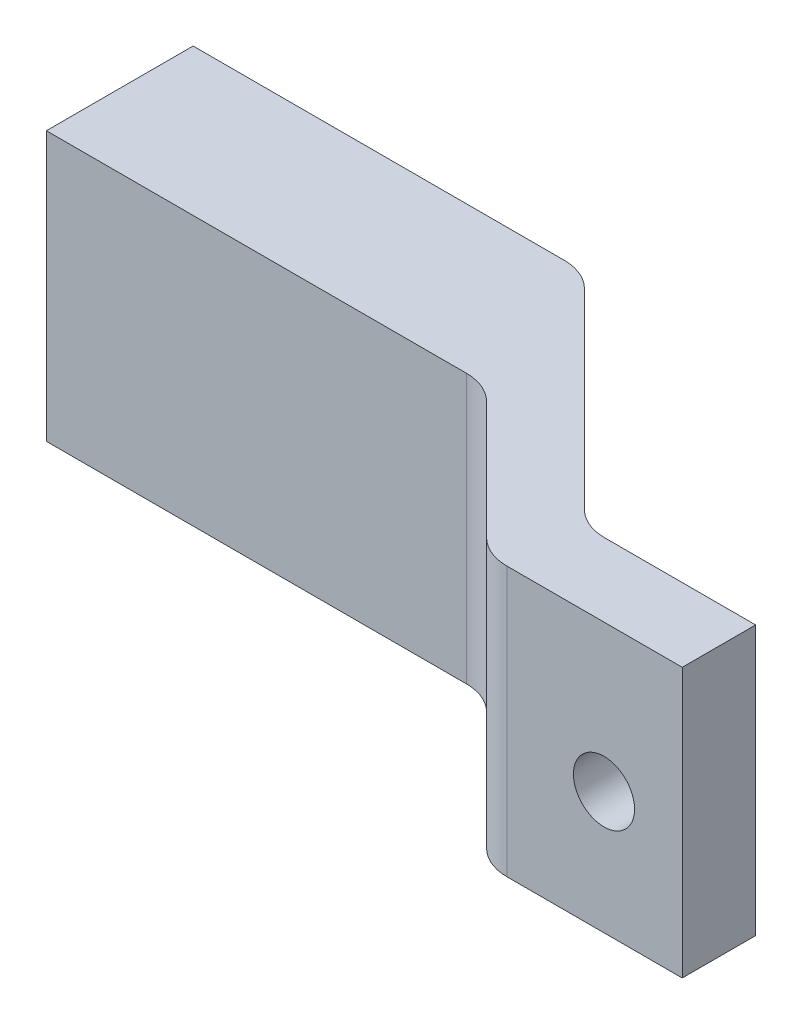
ISO-10303-21;
HEADER;
FILE_DESCRIPTION(('STEP AP214'),'2;1');
FILE_NAME('part.step','',(''),(''),'','','');
FILE_SCHEMA(('AUTOMOTIVE_DESIGN { 1 0 10303 214 1 1 1 1 }'));
ENDSEC;
DATA;
#1=APPLICATION_CONTEXT('core data for automotive mechanical design processes');
#2=APPLICATION_PROTOCOL_DEFINITION('international standard','automotive_design',2000,#1);
#3=PRODUCT_CONTEXT('',#1,'mechanical');
#4=PRODUCT('Part','Part','',(#3));
#5=PRODUCT_RELATED_PRODUCT_CATEGORY('part','',(#4));
#6=PRODUCT_DEFINITION_FORMATION('','',#4);
#7=PRODUCT_DEFINITION_CONTEXT('part definition',#1,'design');
#8=PRODUCT_DEFINITION('design','',#6,#7);
#9=PRODUCT_DEFINITION_SHAPE('','',#8);
#10=(LENGTH_UNIT() NAMED_UNIT(*) SI_UNIT(.MILLI.,.METRE.));
#11=(NAMED_UNIT(*) PLANE_ANGLE_UNIT() SI_UNIT($,.RADIAN.));
#12=(NAMED_UNIT(*) SI_UNIT($,.STERADIAN.) SOLID_ANGLE_UNIT());
#13=UNCERTAINTY_MEASURE_WITH_UNIT(LENGTH_MEASURE(1.E-05),#10,'distance_accuracy_value','');
#14=(GEOMETRIC_REPRESENTATION_CONTEXT(3) GLOBAL_UNCERTAINTY_ASSIGNED_CONTEXT((#13)) GLOBAL_UNIT_ASSIGNED_CONTEXT((#10,
#11,#12)) REPRESENTATION_CONTEXT('',''));
#15=CARTESIAN_POINT('',(0.,0.,0.));
#16=DIRECTION('',(0.,0.,1.));
#17=DIRECTION('',(1.,0.,0.));
#18=AXIS2_PLACEMENT_3D('',#15,#16,#17);
#19=CARTESIAN_POINT('',(0.,0.,6.));
#20=DIRECTION('',(1.,0.,0.));
#21=DIRECTION('',(0.,1.,0.));
#22=AXIS2_PLACEMENT_3D('',#19,#20,#21);
#23=PLANE('',#22);
#24=CARTESIAN_POINT('',(0.,-5.7,2.2));
#25=DIRECTION('',(-1.,0.,0.));
#26=DIRECTION('',(0.,-1.,0.));
#27=AXIS2_PLACEMENT_3D('',#24,#25,#26);
#28=CIRCLE('',#27,1.25);
#29=CARTESIAN_POINT('',(0.,-6.95,2.2));
#30=VERTEX_POINT('',#29);
#31=EDGE_CURVE('E179',#30,#30,#28,.T.);
#32=ORIENTED_EDGE('',*,*,#31,.F.);
#33=EDGE_LOOP('',(#32));
#34=FACE_BOUND('',#33,.T.);
#35=DIRECTION('',(0.,-1.,0.));
#36=VECTOR('',#35,1.);
#37=CARTESIAN_POINT('',(0.,0.,0.));
#38=LINE('',#37,#36);
#39=CARTESIAN_POINT('',(0.,0.,0.));
#40=VERTEX_POINT('',#39);
#41=CARTESIAN_POINT('',(0.,-11.,0.));
#42=VERTEX_POINT('',#41);
#43=EDGE_CURVE('E197',#40,#42,#38,.T.);
#44=ORIENTED_EDGE('',*,*,#43,.T.);
#45=DIRECTION('',(0.,0.,-1.));
#46=VECTOR('',#45,1.);
#47=CARTESIAN_POINT('',(0.,-11.,6.));
#48=LINE('',#47,#46);
#49=CARTESIAN_POINT('',(0.,-11.,6.));
#50=VERTEX_POINT('',#49);
#51=EDGE_CURVE('E227',#50,#42,#48,.T.);
#52=ORIENTED_EDGE('',*,*,#51,.F.);
#53=DIRECTION('',(0.,-1.,0.));
#54=VECTOR('',#53,1.);
#55=CARTESIAN_POINT('',(0.,0.,6.));
#56=LINE('',#55,#54);
#57=CARTESIAN_POINT('',(0.,0.,6.));
#58=VERTEX_POINT('',#57);
#59=EDGE_CURVE('E198',#58,#50,#56,.T.);
#60=ORIENTED_EDGE('',*,*,#59,.F.);
#61=DIRECTION('',(0.,0.,-1.));
#62=VECTOR('',#61,1.);
#63=CARTESIAN_POINT('',(0.,0.,6.));
#64=LINE('',#63,#62);
#65=EDGE_CURVE('E210',#58,#40,#64,.T.);
#66=ORIENTED_EDGE('',*,*,#65,.T.);
#67=EDGE_LOOP('',(#44,#52,#60,#66));
#68=FACE_BOUND('',#67,.T.);
#69=ADVANCED_FACE('F47',(#34,#68),#23,.F.);
#70=CARTESIAN_POINT('',(0.,-11.,6.));
#71=DIRECTION('',(0.,1.,0.));
#72=DIRECTION('',(0.,0.,1.));
#73=AXIS2_PLACEMENT_3D('',#70,#71,#72);
#74=PLANE('',#73);
#75=DIRECTION('',(1.,0.,0.));
#76=VECTOR('',#75,1.);
#77=CARTESIAN_POINT('',(0.,-11.,0.));
#78=LINE('',#77,#76);
#79=CARTESIAN_POINT('',(15.1715728752537,-11.,0.));
#80=VERTEX_POINT('',#79);
#81=EDGE_CURVE('E214',#42,#80,#78,.T.);
#82=ORIENTED_EDGE('',*,*,#81,.T.);
#83=CARTESIAN_POINT('',(15.1715728752537,-11.,2.));
#84=DIRECTION('',(0.,1.,0.));
#85=DIRECTION('',(0.,0.,1.));
#86=AXIS2_PLACEMENT_3D('',#83,#84,#85);
#87=CIRCLE('',#86,2.);
#88=CARTESIAN_POINT('',(16.5857864376268,-11.,0.58578643762691));
#89=VERTEX_POINT('',#88);
#90=EDGE_CURVE('E266',#80,#89,#87,.F.);
#91=ORIENTED_EDGE('',*,*,#90,.T.);
#92=DIRECTION('',(-0.707106781186544,0.,-0.707106781186551));
#93=VECTOR('',#92,1.);
#94=CARTESIAN_POINT('',(26.,-11.,10.0000000000002));
#95=LINE('',#94,#93);
#96=CARTESIAN_POINT('',(18.,-11.,2.00000000000009));
#97=VERTEX_POINT('',#96);
#98=EDGE_CURVE('E244',#89,#97,#95,.F.);
#99=ORIENTED_EDGE('',*,*,#98,.T.);
#100=DIRECTION('',(0.,0.,-1.));
#101=VECTOR('',#100,1.);
#102=CARTESIAN_POINT('',(18.,-11.,6.));
#103=LINE('',#102,#101);
#104=CARTESIAN_POINT('',(18.,-11.,6.));
#105=VERTEX_POINT('',#104);
#106=EDGE_CURVE('E223',#105,#97,#103,.T.);
#107=ORIENTED_EDGE('',*,*,#106,.F.);
#108=DIRECTION('',(-0.707106781186546,0.,-0.707106781186549));
#109=VECTOR('',#108,1.);
#110=CARTESIAN_POINT('',(24.,-11.,12.));
#111=LINE('',#110,#109);
#112=CARTESIAN_POINT('',(18.5857864376269,-11.,6.58578643762691));
#113=VERTEX_POINT('',#112);
#114=EDGE_CURVE('E62',#113,#105,#111,.T.);
#115=ORIENTED_EDGE('',*,*,#114,.F.);
#116=CARTESIAN_POINT('',(17.1715728752538,-11.,8.));
#117=DIRECTION('',(0.,1.,0.));
#118=DIRECTION('',(0.,0.,1.));
#119=AXIS2_PLACEMENT_3D('',#116,#117,#118);
#120=CIRCLE('',#119,2.);
#121=CARTESIAN_POINT('',(17.1715728752538,-11.,6.));
#122=VERTEX_POINT('',#121);
#123=EDGE_CURVE('E11',#113,#122,#120,.T.);
#124=ORIENTED_EDGE('',*,*,#123,.T.);
#125=DIRECTION('',(1.,0.,0.));
#126=VECTOR('',#125,1.);
#127=CARTESIAN_POINT('',(0.,-11.,6.));
#128=LINE('',#127,#126);
#129=EDGE_CURVE('E202',#50,#122,#128,.T.);
#130=ORIENTED_EDGE('',*,*,#129,.F.);
#131=ORIENTED_EDGE('',*,*,#51,.T.);
#132=EDGE_LOOP('',(#82,#91,#99,#107,#115,#124,#130,#131));
#133=FACE_BOUND('',#132,.T.);
#134=ADVANCED_FACE('F320',(#133),#74,.F.);
#135=CARTESIAN_POINT('',(0.,0.,6.));
#136=DIRECTION('',(0.,-1.,0.));
#137=DIRECTION('',(0.,0.,-1.));
#138=AXIS2_PLACEMENT_3D('',#135,#136,#137);
#139=PLANE('',#138);
#140=DIRECTION('',(0.707106781186544,0.,0.707106781186551));
#141=VECTOR('',#140,1.);
#142=CARTESIAN_POINT('',(26.,0.,10.0000000000002));
#143=LINE('',#142,#141);
#144=CARTESIAN_POINT('',(24.4142135623729,0.,8.41421356237309));
#145=VERTEX_POINT('',#144);
#146=CARTESIAN_POINT('',(16.5857864376268,0.,0.58578643762691));
#147=VERTEX_POINT('',#146);
#148=EDGE_CURVE('E231',#145,#147,#143,.F.);
#149=ORIENTED_EDGE('',*,*,#148,.T.);
#150=CARTESIAN_POINT('',(15.1715728752537,0.,2.));
#151=DIRECTION('',(0.,-1.,0.));
#152=DIRECTION('',(0.,0.,-1.));
#153=AXIS2_PLACEMENT_3D('',#150,#151,#152);
#154=CIRCLE('',#153,2.);
#155=CARTESIAN_POINT('',(15.1715728752537,0.,0.));
#156=VERTEX_POINT('',#155);
#157=EDGE_CURVE('E278',#147,#156,#154,.F.);
#158=ORIENTED_EDGE('',*,*,#157,.T.);
#159=DIRECTION('',(-1.,0.,0.));
#160=VECTOR('',#159,1.);
#161=CARTESIAN_POINT('',(0.,0.,0.));
#162=LINE('',#161,#160);
#163=EDGE_CURVE('E203',#156,#40,#162,.T.);
#164=ORIENTED_EDGE('',*,*,#163,.T.);
#165=ORIENTED_EDGE('',*,*,#65,.F.);
#166=DIRECTION('',(-1.,0.,0.));
#167=VECTOR('',#166,1.);
#168=CARTESIAN_POINT('',(0.,0.,6.));
#169=LINE('',#168,#167);
#170=CARTESIAN_POINT('',(17.1715728752538,0.,6.));
#171=VERTEX_POINT('',#170);
#172=EDGE_CURVE('E207',#171,#58,#169,.T.);
#173=ORIENTED_EDGE('',*,*,#172,.F.);
#174=CARTESIAN_POINT('',(17.1715728752538,0.,8.));
#175=DIRECTION('',(0.,-1.,0.));
#176=DIRECTION('',(0.,0.,-1.));
#177=AXIS2_PLACEMENT_3D('',#174,#175,#176);
#178=CIRCLE('',#177,2.);
#179=CARTESIAN_POINT('',(18.5857864376269,0.,6.58578643762691));
#180=VERTEX_POINT('',#179);
#181=EDGE_CURVE('E56',#171,#180,#178,.T.);
#182=ORIENTED_EDGE('',*,*,#181,.T.);
#183=DIRECTION('',(0.707106781186546,0.,0.707106781186549));
#184=VECTOR('',#183,1.);
#185=CARTESIAN_POINT('',(24.,0.,12.));
#186=LINE('',#185,#184);
#187=CARTESIAN_POINT('',(23.4142135623731,0.,11.4142135623731));
#188=VERTEX_POINT('',#187);
#189=EDGE_CURVE('E258',#180,#188,#186,.T.);
#190=ORIENTED_EDGE('',*,*,#189,.T.);
#191=CARTESIAN_POINT('',(24.8284271247462,0.,10.));
#192=DIRECTION('',(0.,-1.,0.));
#193=DIRECTION('',(0.,0.,-1.));
#194=AXIS2_PLACEMENT_3D('',#191,#192,#193);
#195=CIRCLE('',#194,2.);
#196=CARTESIAN_POINT('',(24.8284271247462,0.,12.));
#197=VERTEX_POINT('',#196);
#198=EDGE_CURVE('E275',#188,#197,#195,.F.);
#199=ORIENTED_EDGE('',*,*,#198,.T.);
#200=DIRECTION('',(-1.,0.,0.));
#201=VECTOR('',#200,1.);
#202=CARTESIAN_POINT('',(26.,0.,12.));
#203=LINE('',#202,#201);
#204=CARTESIAN_POINT('',(32.,0.,12.));
#205=VERTEX_POINT('',#204);
#206=EDGE_CURVE('E157',#205,#197,#203,.T.);
#207=ORIENTED_EDGE('',*,*,#206,.F.);
#208=DIRECTION('',(0.,0.,1.));
#209=VECTOR('',#208,1.);
#210=CARTESIAN_POINT('',(32.,0.,12.));
#211=LINE('',#210,#209);
#212=CARTESIAN_POINT('',(32.,0.,9.));
#213=VERTEX_POINT('',#212);
#214=EDGE_CURVE('E173',#213,#205,#211,.T.);
#215=ORIENTED_EDGE('',*,*,#214,.F.);
#216=DIRECTION('',(-1.,0.,0.));
#217=VECTOR('',#216,1.);
#218=CARTESIAN_POINT('',(32.,0.,9.));
#219=LINE('',#218,#217);
#220=CARTESIAN_POINT('',(25.828427124746,0.,9.));
#221=VERTEX_POINT('',#220);
#222=EDGE_CURVE('E187',#213,#221,#219,.T.);
#223=ORIENTED_EDGE('',*,*,#222,.T.);
#224=CARTESIAN_POINT('',(25.828427124746,0.,7.));
#225=DIRECTION('',(0.,-1.,0.));
#226=DIRECTION('',(0.,0.,-1.));
#227=AXIS2_PLACEMENT_3D('',#224,#225,#226);
#228=CIRCLE('',#227,2.);
#229=EDGE_CURVE('E301',#221,#145,#228,.T.);
#230=ORIENTED_EDGE('',*,*,#229,.T.);
#231=EDGE_LOOP('',(#149,#158,#164,#165,#173,#182,#190,#199,#207,#215,#223,#230));
#232=FACE_BOUND('',#231,.T.);
#233=ADVANCED_FACE('F310',(#232),#139,.F.);
#234=CARTESIAN_POINT('',(0.,0.,6.));
#235=DIRECTION('',(0.,0.,1.));
#236=DIRECTION('',(1.,0.,0.));
#237=AXIS2_PLACEMENT_3D('',#234,#235,#236);
#238=PLANE('',#237);
#239=ORIENTED_EDGE('',*,*,#129,.T.);
#240=DIRECTION('',(0.,1.,0.));
#241=VECTOR('',#240,1.);
#242=CARTESIAN_POINT('',(17.1715728752538,0.,6.));
#243=LINE('',#242,#241);
#244=EDGE_CURVE('E297',#122,#171,#243,.T.);
#245=ORIENTED_EDGE('',*,*,#244,.T.);
#246=ORIENTED_EDGE('',*,*,#172,.T.);
#247=ORIENTED_EDGE('',*,*,#59,.T.);
#248=EDGE_LOOP('',(#239,#245,#246,#247));
#249=FACE_BOUND('',#248,.T.);
#250=ADVANCED_FACE('F322',(#249),#238,.T.);
#251=CARTESIAN_POINT('',(0.,0.,0.));
#252=DIRECTION('',(0.,0.,1.));
#253=DIRECTION('',(1.,0.,0.));
#254=AXIS2_PLACEMENT_3D('',#251,#252,#253);
#255=PLANE('',#254);
#256=ORIENTED_EDGE('',*,*,#163,.F.);
#257=DIRECTION('',(0.,1.,0.));
#258=VECTOR('',#257,1.);
#259=CARTESIAN_POINT('',(15.1715728752537,-11.,0.));
#260=LINE('',#259,#258);
#261=EDGE_CURVE('E262',#156,#80,#260,.F.);
#262=ORIENTED_EDGE('',*,*,#261,.T.);
#263=ORIENTED_EDGE('',*,*,#81,.F.);
#264=ORIENTED_EDGE('',*,*,#43,.F.);
#265=EDGE_LOOP('',(#256,#262,#263,#264));
#266=FACE_BOUND('',#265,.T.);
#267=ADVANCED_FACE('F330',(#266),#255,.F.);
#268=CARTESIAN_POINT('',(18.,0.,0.));
#269=DIRECTION('',(-1.,0.,0.));
#270=DIRECTION('',(0.,0.,1.));
#271=AXIS2_PLACEMENT_3D('',#268,#269,#270);
#272=PLANE('',#271);
#273=DIRECTION('',(0.,0.,-1.));
#274=VECTOR('',#273,1.);
#275=CARTESIAN_POINT('',(18.,-11.0024904548713,0.));
#276=LINE('',#275,#274);
#277=CARTESIAN_POINT('',(18.,-11.0024904548713,5.99999999999997));
#278=VERTEX_POINT('',#277);
#279=CARTESIAN_POINT('',(18.,-11.0024904548713,2.00000000000009));
#280=VERTEX_POINT('',#279);
#281=EDGE_CURVE('E158',#278,#280,#276,.T.);
#282=ORIENTED_EDGE('',*,*,#281,.F.);
#283=DIRECTION('',(0.,1.,0.));
#284=VECTOR('',#283,1.);
#285=CARTESIAN_POINT('',(18.,0.,5.99999999999997));
#286=LINE('',#285,#284);
#287=EDGE_CURVE('E254',#278,#105,#286,.T.);
#288=ORIENTED_EDGE('',*,*,#287,.T.);
#289=ORIENTED_EDGE('',*,*,#106,.T.);
#290=DIRECTION('',(0.,1.,0.));
#291=VECTOR('',#290,1.);
#292=CARTESIAN_POINT('',(18.,0.,2.00000000000009));
#293=LINE('',#292,#291);
#294=EDGE_CURVE('E247',#97,#280,#293,.F.);
#295=ORIENTED_EDGE('',*,*,#294,.T.);
#296=EDGE_LOOP('',(#282,#288,#289,#295));
#297=FACE_BOUND('',#296,.T.);
#298=ADVANCED_FACE('F466',(#297),#272,.T.);
#299=CARTESIAN_POINT('',(26.,0.,12.));
#300=DIRECTION('',(0.,0.,-1.));
#301=DIRECTION('',(0.,1.,0.));
#302=AXIS2_PLACEMENT_3D('',#299,#300,#301);
#303=PLANE('',#302);
#304=CARTESIAN_POINT('',(28.8,-6.00249045487134,12.));
#305=DIRECTION('',(0.,0.,1.));
#306=DIRECTION('',(1.,0.,0.));
#307=AXIS2_PLACEMENT_3D('',#304,#305,#306);
#308=CIRCLE('',#307,1.25);
#309=CARTESIAN_POINT('',(30.05,-6.00249045487134,12.));
#310=VERTEX_POINT('',#309);
#311=EDGE_CURVE('E236',#310,#310,#308,.T.);
#312=ORIENTED_EDGE('',*,*,#311,.F.);
#313=EDGE_LOOP('',(#312));
#314=FACE_BOUND('',#313,.T.);
#315=ORIENTED_EDGE('',*,*,#206,.T.);
#316=DIRECTION('',(0.,-1.,0.));
#317=VECTOR('',#316,1.);
#318=CARTESIAN_POINT('',(24.8284271247462,-11.0024904548713,12.));
#319=LINE('',#318,#317);
#320=CARTESIAN_POINT('',(24.8284271247462,-11.0024904548713,12.));
#321=VERTEX_POINT('',#320);
#322=EDGE_CURVE('E155',#197,#321,#319,.T.);
#323=ORIENTED_EDGE('',*,*,#322,.T.);
#324=DIRECTION('',(-1.,0.,0.));
#325=VECTOR('',#324,1.);
#326=CARTESIAN_POINT('',(26.,-11.0024904548713,12.));
#327=LINE('',#326,#325);
#328=CARTESIAN_POINT('',(32.,-11.0024904548713,12.));
#329=VERTEX_POINT('',#328);
#330=EDGE_CURVE('E148',#329,#321,#327,.T.);
#331=ORIENTED_EDGE('',*,*,#330,.F.);
#332=DIRECTION('',(0.,-1.,0.));
#333=VECTOR('',#332,1.);
#334=CARTESIAN_POINT('',(32.,0.,12.));
#335=LINE('',#334,#333);
#336=EDGE_CURVE('E153',#205,#329,#335,.T.);
#337=ORIENTED_EDGE('',*,*,#336,.F.);
#338=EDGE_LOOP('',(#315,#323,#331,#337));
#339=FACE_BOUND('',#338,.T.);
#340=ADVANCED_FACE('F151',(#314,#339),#303,.F.);
#341=CARTESIAN_POINT('',(26.,-11.0024904548713,0.));
#342=DIRECTION('',(0.,1.,0.));
#343=DIRECTION('',(0.,0.,1.));
#344=AXIS2_PLACEMENT_3D('',#341,#342,#343);
#345=PLANE('',#344);
#346=ORIENTED_EDGE('',*,*,#330,.T.);
#347=CARTESIAN_POINT('',(24.8284271247462,-11.0024904548713,10.));
#348=DIRECTION('',(0.,1.,0.));
#349=DIRECTION('',(0.,0.,1.));
#350=AXIS2_PLACEMENT_3D('',#347,#348,#349);
#351=CIRCLE('',#350,2.);
#352=CARTESIAN_POINT('',(23.4142135623731,-11.0024904548713,11.4142135623731));
#353=VERTEX_POINT('',#352);
#354=EDGE_CURVE('E70',#321,#353,#351,.F.);
#355=ORIENTED_EDGE('',*,*,#354,.T.);
#356=DIRECTION('',(-0.707106781186546,0.,-0.707106781186549));
#357=VECTOR('',#356,1.);
#358=CARTESIAN_POINT('',(24.,-11.0024904548713,12.));
#359=LINE('',#358,#357);
#360=EDGE_CURVE('E251',#353,#278,#359,.T.);
#361=ORIENTED_EDGE('',*,*,#360,.T.);
#362=ORIENTED_EDGE('',*,*,#281,.T.);
#363=DIRECTION('',(-0.707106781186544,0.,-0.707106781186551));
#364=VECTOR('',#363,1.);
#365=CARTESIAN_POINT('',(26.,-11.0024904548713,10.0000000000002));
#366=LINE('',#365,#364);
#367=CARTESIAN_POINT('',(24.4142135623729,-11.0024904548713,8.41421356237309));
#368=VERTEX_POINT('',#367);
#369=EDGE_CURVE('E240',#280,#368,#366,.F.);
#370=ORIENTED_EDGE('',*,*,#369,.T.);
#371=CARTESIAN_POINT('',(25.828427124746,-11.0024904548713,7.));
#372=DIRECTION('',(0.,1.,0.));
#373=DIRECTION('',(0.,0.,1.));
#374=AXIS2_PLACEMENT_3D('',#371,#372,#373);
#375=CIRCLE('',#374,2.);
#376=CARTESIAN_POINT('',(25.828427124746,-11.0024904548713,9.));
#377=VERTEX_POINT('',#376);
#378=EDGE_CURVE('E304',#368,#377,#375,.T.);
#379=ORIENTED_EDGE('',*,*,#378,.T.);
#380=DIRECTION('',(-1.,0.,0.));
#381=VECTOR('',#380,1.);
#382=CARTESIAN_POINT('',(32.,-11.0024904548713,9.));
#383=LINE('',#382,#381);
#384=CARTESIAN_POINT('',(32.,-11.0024904548713,9.));
#385=VERTEX_POINT('',#384);
#386=EDGE_CURVE('E164',#385,#377,#383,.T.);
#387=ORIENTED_EDGE('',*,*,#386,.F.);
#388=DIRECTION('',(0.,0.,-1.));
#389=VECTOR('',#388,1.);
#390=CARTESIAN_POINT('',(32.,-11.0024904548713,12.));
#391=LINE('',#390,#389);
#392=EDGE_CURVE('E161',#329,#385,#391,.T.);
#393=ORIENTED_EDGE('',*,*,#392,.F.);
#394=EDGE_LOOP('',(#346,#355,#361,#362,#370,#379,#387,#393));
#395=FACE_BOUND('',#394,.T.);
#396=ADVANCED_FACE('F162',(#395),#345,.F.);
#397=CARTESIAN_POINT('',(32.,0.,9.));
#398=DIRECTION('',(0.,0.,1.));
#399=DIRECTION('',(0.,-1.,0.));
#400=AXIS2_PLACEMENT_3D('',#397,#398,#399);
#401=PLANE('',#400);
#402=CARTESIAN_POINT('',(28.8,-6.00249045487134,9.));
#403=DIRECTION('',(0.,0.,1.));
#404=DIRECTION('',(0.,-1.,0.));
#405=AXIS2_PLACEMENT_3D('',#402,#403,#404);
#406=CIRCLE('',#405,1.25);
#407=CARTESIAN_POINT('',(28.8,-7.25249045487134,9.));
#408=VERTEX_POINT('',#407);
#409=EDGE_CURVE('E232',#408,#408,#406,.T.);
#410=ORIENTED_EDGE('',*,*,#409,.T.);
#411=EDGE_LOOP('',(#410));
#412=FACE_BOUND('',#411,.T.);
#413=ORIENTED_EDGE('',*,*,#386,.T.);
#414=DIRECTION('',(0.,-1.,0.));
#415=VECTOR('',#414,1.);
#416=CARTESIAN_POINT('',(25.828427124746,0.,9.));
#417=LINE('',#416,#415);
#418=EDGE_CURVE('E281',#377,#221,#417,.F.);
#419=ORIENTED_EDGE('',*,*,#418,.T.);
#420=ORIENTED_EDGE('',*,*,#222,.F.);
#421=DIRECTION('',(0.,1.,0.));
#422=VECTOR('',#421,1.);
#423=CARTESIAN_POINT('',(32.,0.,9.));
#424=LINE('',#423,#422);
#425=EDGE_CURVE('E168',#385,#213,#424,.T.);
#426=ORIENTED_EDGE('',*,*,#425,.F.);
#427=EDGE_LOOP('',(#413,#419,#420,#426));
#428=FACE_BOUND('',#427,.T.);
#429=ADVANCED_FACE('F347',(#412,#428),#401,.F.);
#430=CARTESIAN_POINT('',(32.,0.,0.));
#431=DIRECTION('',(1.,0.,0.));
#432=DIRECTION('',(0.,0.,-1.));
#433=AXIS2_PLACEMENT_3D('',#430,#431,#432);
#434=PLANE('',#433);
#435=ORIENTED_EDGE('',*,*,#336,.T.);
#436=ORIENTED_EDGE('',*,*,#392,.T.);
#437=ORIENTED_EDGE('',*,*,#425,.T.);
#438=ORIENTED_EDGE('',*,*,#214,.T.);
#439=EDGE_LOOP('',(#435,#436,#437,#438));
#440=FACE_BOUND('',#439,.T.);
#441=ADVANCED_FACE('F171',(#440),#434,.T.);
#442=CARTESIAN_POINT('',(10.,-5.7,2.2));
#443=DIRECTION('',(-1.,0.,0.));
#444=DIRECTION('',(0.,-1.,0.));
#445=AXIS2_PLACEMENT_3D('',#442,#443,#444);
#446=CYLINDRICAL_SURFACE('',#445,1.25);
#447=CARTESIAN_POINT('',(10.,-5.7,2.2));
#448=DIRECTION('',(-1.,0.,0.));
#449=DIRECTION('',(0.,-1.,0.));
#450=AXIS2_PLACEMENT_3D('',#447,#448,#449);
#451=CIRCLE('',#450,1.25);
#452=CARTESIAN_POINT('',(10.,-6.95,2.2));
#453=VERTEX_POINT('',#452);
#454=EDGE_CURVE('E175',#453,#453,#451,.T.);
#455=ORIENTED_EDGE('',*,*,#454,.F.);
#456=EDGE_LOOP('',(#455));
#457=FACE_BOUND('',#456,.T.);
#458=ORIENTED_EDGE('',*,*,#31,.T.);
#459=EDGE_LOOP('',(#458));
#460=FACE_BOUND('',#459,.T.);
#461=ADVANCED_FACE('F427',(#457,#460),#446,.F.);
#462=CARTESIAN_POINT('',(10.,-5.7,2.2));
#463=DIRECTION('',(-1.,0.,0.));
#464=DIRECTION('',(0.,-1.,0.));
#465=AXIS2_PLACEMENT_3D('',#462,#463,#464);
#466=PLANE('',#465);
#467=ORIENTED_EDGE('',*,*,#454,.T.);
#468=EDGE_LOOP('',(#467));
#469=FACE_BOUND('',#468,.T.);
#470=ADVANCED_FACE('F418',(#469),#466,.T.);
#471=CARTESIAN_POINT('',(28.8,-6.00249045487134,2.));
#472=DIRECTION('',(0.,0.,1.));
#473=DIRECTION('',(1.,0.,0.));
#474=AXIS2_PLACEMENT_3D('',#471,#472,#473);
#475=CYLINDRICAL_SURFACE('',#474,1.25);
#476=ORIENTED_EDGE('',*,*,#311,.T.);
#477=EDGE_LOOP('',(#476));
#478=FACE_BOUND('',#477,.T.);
#479=ORIENTED_EDGE('',*,*,#409,.F.);
#480=EDGE_LOOP('',(#479));
#481=FACE_BOUND('',#480,.T.);
#482=ADVANCED_FACE('F374',(#478,#481),#475,.F.);
#483=CARTESIAN_POINT('',(26.,0.,10.0000000000002));
#484=DIRECTION('',(-0.707106781186551,0.,0.707106781186544));
#485=DIRECTION('',(0.,1.,0.));
#486=AXIS2_PLACEMENT_3D('',#483,#484,#485);
#487=PLANE('',#486);
#488=ORIENTED_EDGE('',*,*,#98,.F.);
#489=DIRECTION('',(0.,-1.,0.));
#490=VECTOR('',#489,1.);
#491=CARTESIAN_POINT('',(16.5857864376268,0.,0.585786437626912));
#492=LINE('',#491,#490);
#493=EDGE_CURVE('E272',#89,#147,#492,.F.);
#494=ORIENTED_EDGE('',*,*,#493,.T.);
#495=ORIENTED_EDGE('',*,*,#148,.F.);
#496=DIRECTION('',(0.,1.,0.));
#497=VECTOR('',#496,1.);
#498=CARTESIAN_POINT('',(24.4142135623729,0.,8.41421356237309));
#499=LINE('',#498,#497);
#500=EDGE_CURVE('E269',#145,#368,#499,.F.);
#501=ORIENTED_EDGE('',*,*,#500,.T.);
#502=ORIENTED_EDGE('',*,*,#369,.F.);
#503=ORIENTED_EDGE('',*,*,#294,.F.);
#504=EDGE_LOOP('',(#488,#494,#495,#501,#502,#503));
#505=FACE_BOUND('',#504,.T.);
#506=ADVANCED_FACE('F338',(#505),#487,.F.);
#507=CARTESIAN_POINT('',(24.,0.,12.));
#508=DIRECTION('',(-0.707106781186549,0.,0.707106781186546));
#509=DIRECTION('',(0.,1.,0.));
#510=AXIS2_PLACEMENT_3D('',#507,#508,#509);
#511=PLANE('',#510);
#512=ORIENTED_EDGE('',*,*,#360,.F.);
#513=DIRECTION('',(0.,-1.,0.));
#514=VECTOR('',#513,1.);
#515=CARTESIAN_POINT('',(23.4142135623731,0.,11.4142135623731));
#516=LINE('',#515,#514);
#517=EDGE_CURVE('E294',#353,#188,#516,.F.);
#518=ORIENTED_EDGE('',*,*,#517,.T.);
#519=ORIENTED_EDGE('',*,*,#189,.F.);
#520=DIRECTION('',(0.,1.,0.));
#521=VECTOR('',#520,1.);
#522=CARTESIAN_POINT('',(18.5857864376269,-11.,6.58578643762691));
#523=LINE('',#522,#521);
#524=EDGE_CURVE('E291',#180,#113,#523,.F.);
#525=ORIENTED_EDGE('',*,*,#524,.T.);
#526=ORIENTED_EDGE('',*,*,#114,.T.);
#527=ORIENTED_EDGE('',*,*,#287,.F.);
#528=EDGE_LOOP('',(#512,#518,#519,#525,#526,#527));
#529=FACE_BOUND('',#528,.T.);
#530=ADVANCED_FACE('F317',(#529),#511,.T.);
#531=CARTESIAN_POINT('',(15.1715728752537,0.,2.));
#532=DIRECTION('',(0.,-1.,0.));
#533=DIRECTION('',(0.,0.,-1.));
#534=AXIS2_PLACEMENT_3D('',#531,#532,#533);
#535=CYLINDRICAL_SURFACE('',#534,2.);
#536=ORIENTED_EDGE('',*,*,#157,.F.);
#537=ORIENTED_EDGE('',*,*,#493,.F.);
#538=ORIENTED_EDGE('',*,*,#90,.F.);
#539=ORIENTED_EDGE('',*,*,#261,.F.);
#540=EDGE_LOOP('',(#536,#537,#538,#539));
#541=FACE_BOUND('',#540,.T.);
#542=ADVANCED_FACE('F334',(#541),#535,.T.);
#543=CARTESIAN_POINT('',(25.828427124746,0.,7.));
#544=DIRECTION('',(0.,-1.,0.));
#545=DIRECTION('',(0.,0.,-1.));
#546=AXIS2_PLACEMENT_3D('',#543,#544,#545);
#547=CYLINDRICAL_SURFACE('',#546,2.);
#548=ORIENTED_EDGE('',*,*,#378,.F.);
#549=ORIENTED_EDGE('',*,*,#500,.F.);
#550=ORIENTED_EDGE('',*,*,#229,.F.);
#551=ORIENTED_EDGE('',*,*,#418,.F.);
#552=EDGE_LOOP('',(#548,#549,#550,#551));
#553=FACE_BOUND('',#552,.T.);
#554=ADVANCED_FACE('F345',(#553),#547,.F.);
#555=CARTESIAN_POINT('',(24.8284271247462,0.,10.));
#556=DIRECTION('',(0.,1.,0.));
#557=DIRECTION('',(0.,0.,1.));
#558=AXIS2_PLACEMENT_3D('',#555,#556,#557);
#559=CYLINDRICAL_SURFACE('',#558,2.);
#560=ORIENTED_EDGE('',*,*,#198,.F.);
#561=ORIENTED_EDGE('',*,*,#517,.F.);
#562=ORIENTED_EDGE('',*,*,#354,.F.);
#563=ORIENTED_EDGE('',*,*,#322,.F.);
#564=EDGE_LOOP('',(#560,#561,#562,#563));
#565=FACE_BOUND('',#564,.T.);
#566=ADVANCED_FACE('F349',(#565),#559,.T.);
#567=CARTESIAN_POINT('',(17.1715728752538,0.,8.));
#568=DIRECTION('',(0.,-1.,0.));
#569=DIRECTION('',(1.,0.,0.));
#570=AXIS2_PLACEMENT_3D('',#567,#568,#569);
#571=CYLINDRICAL_SURFACE('',#570,2.);
#572=ORIENTED_EDGE('',*,*,#123,.F.);
#573=ORIENTED_EDGE('',*,*,#524,.F.);
#574=ORIENTED_EDGE('',*,*,#181,.F.);
#575=ORIENTED_EDGE('',*,*,#244,.F.);
#576=EDGE_LOOP('',(#572,#573,#574,#575));
#577=FACE_BOUND('',#576,.T.);
#578=ADVANCED_FACE('F49',(#577),#571,.F.);
#579=CLOSED_SHELL('',(#69,#134,#233,#250,#267,#298,#340,#396,#429,#441,#461,#470,#482,#506,#530,
#542,#554,#566,#578));
#580=MANIFOLD_SOLID_BREP('B2',#579);
#581=ADVANCED_BREP_SHAPE_REPRESENTATION('',(#18,#580),#14);
#582=SHAPE_DEFINITION_REPRESENTATION(#9,#581);
ENDSEC;
END-ISO-10303-21;
